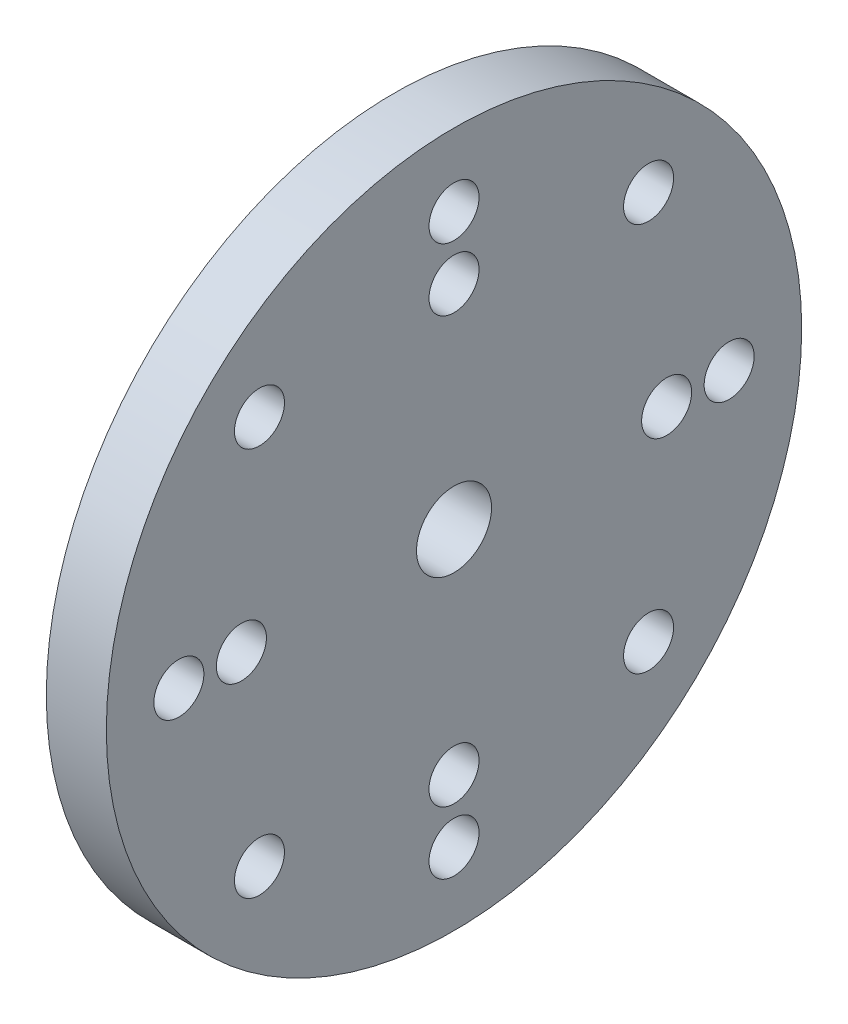
ISO-10303-21;
HEADER;
FILE_DESCRIPTION(('STEP AP214'),'2;1');
FILE_NAME('part.step','',(''),(''),'','','');
FILE_SCHEMA(('AUTOMOTIVE_DESIGN { 1 0 10303 214 1 1 1 1 }'));
ENDSEC;
DATA;
#1=APPLICATION_CONTEXT('core data for automotive mechanical design processes');
#2=APPLICATION_PROTOCOL_DEFINITION('international standard','automotive_design',2000,#1);
#3=PRODUCT_CONTEXT('',#1,'mechanical');
#4=PRODUCT('Part','Part','',(#3));
#5=PRODUCT_RELATED_PRODUCT_CATEGORY('part','',(#4));
#6=PRODUCT_DEFINITION_FORMATION('','',#4);
#7=PRODUCT_DEFINITION_CONTEXT('part definition',#1,'design');
#8=PRODUCT_DEFINITION('design','',#6,#7);
#9=PRODUCT_DEFINITION_SHAPE('','',#8);
#10=(LENGTH_UNIT() NAMED_UNIT(*) SI_UNIT(.MILLI.,.METRE.));
#11=(NAMED_UNIT(*) PLANE_ANGLE_UNIT() SI_UNIT($,.RADIAN.));
#12=(NAMED_UNIT(*) SI_UNIT($,.STERADIAN.) SOLID_ANGLE_UNIT());
#13=UNCERTAINTY_MEASURE_WITH_UNIT(LENGTH_MEASURE(1.E-05),#10,'distance_accuracy_value','');
#14=(GEOMETRIC_REPRESENTATION_CONTEXT(3) GLOBAL_UNCERTAINTY_ASSIGNED_CONTEXT((#13)) GLOBAL_UNIT_ASSIGNED_CONTEXT((#10,
#11,#12)) REPRESENTATION_CONTEXT('',''));
#15=CARTESIAN_POINT('',(0.,0.,0.));
#16=DIRECTION('',(0.,0.,1.));
#17=DIRECTION('',(1.,0.,0.));
#18=AXIS2_PLACEMENT_3D('',#15,#16,#17);
#19=CARTESIAN_POINT('',(0.,0.,0.));
#20=DIRECTION('',(1.,0.,0.));
#21=DIRECTION('',(0.,0.,-1.));
#22=AXIS2_PLACEMENT_3D('',#19,#20,#21);
#23=PLANE('',#22);
#24=CARTESIAN_POINT('',(0.,0.,0.));
#25=DIRECTION('',(1.,0.,0.));
#26=DIRECTION('',(0.,0.,-1.));
#27=AXIS2_PLACEMENT_3D('',#24,#25,#26);
#28=CIRCLE('',#27,1.5);
#29=CARTESIAN_POINT('',(0.,0.,-1.5));
#30=VERTEX_POINT('',#29);
#31=EDGE_CURVE('E123',#30,#30,#28,.T.);
#32=ORIENTED_EDGE('',*,*,#31,.T.);
#33=EDGE_LOOP('',(#32));
#34=FACE_BOUND('',#33,.T.);
#35=CARTESIAN_POINT('',(0.,0.,0.));
#36=DIRECTION('',(-1.,0.,0.));
#37=DIRECTION('',(0.,0.,1.));
#38=AXIS2_PLACEMENT_3D('',#35,#36,#37);
#39=CIRCLE('',#38,4.95);
#40=CARTESIAN_POINT('',(0.,0.,4.95));
#41=VERTEX_POINT('',#40);
#42=EDGE_CURVE('E10',#41,#41,#39,.T.);
#43=ORIENTED_EDGE('',*,*,#42,.T.);
#44=EDGE_LOOP('',(#43));
#45=FACE_BOUND('',#44,.T.);
#46=ADVANCED_FACE('F36',(#34,#45),#23,.F.);
#47=CARTESIAN_POINT('',(0.,0.,0.));
#48=DIRECTION('',(-1.,0.,0.));
#49=DIRECTION('',(0.,0.,1.));
#50=AXIS2_PLACEMENT_3D('',#47,#48,#49);
#51=CYLINDRICAL_SURFACE('',#50,4.95);
#52=ORIENTED_EDGE('',*,*,#42,.F.);
#53=EDGE_LOOP('',(#52));
#54=FACE_BOUND('',#53,.T.);
#55=CARTESIAN_POINT('',(2.,0.,0.));
#56=DIRECTION('',(-1.,0.,0.));
#57=DIRECTION('',(0.,0.,1.));
#58=AXIS2_PLACEMENT_3D('',#55,#56,#57);
#59=CIRCLE('',#58,4.95);
#60=CARTESIAN_POINT('',(2.,0.,4.95));
#61=VERTEX_POINT('',#60);
#62=EDGE_CURVE('E42',#61,#61,#59,.T.);
#63=ORIENTED_EDGE('',*,*,#62,.T.);
#64=EDGE_LOOP('',(#63));
#65=FACE_BOUND('',#64,.T.);
#66=ADVANCED_FACE('F176',(#54,#65),#51,.T.);
#67=CARTESIAN_POINT('',(2.,4.95,0.));
#68=DIRECTION('',(1.,0.,0.));
#69=DIRECTION('',(0.,0.,-1.));
#70=AXIS2_PLACEMENT_3D('',#67,#68,#69);
#71=PLANE('',#70);
#72=CARTESIAN_POINT('',(2.,0.,-8.5));
#73=DIRECTION('',(1.,0.,0.));
#74=DIRECTION('',(0.,0.,-1.));
#75=AXIS2_PLACEMENT_3D('',#72,#73,#74);
#76=CIRCLE('',#75,1.);
#77=CARTESIAN_POINT('',(2.,0.,-9.5));
#78=VERTEX_POINT('',#77);
#79=EDGE_CURVE('E107',#78,#78,#76,.T.);
#80=ORIENTED_EDGE('',*,*,#79,.T.);
#81=EDGE_LOOP('',(#80));
#82=FACE_BOUND('',#81,.T.);
#83=CARTESIAN_POINT('',(2.,-8.5,0.));
#84=DIRECTION('',(1.,0.,0.));
#85=DIRECTION('',(0.,0.,-1.));
#86=AXIS2_PLACEMENT_3D('',#83,#84,#85);
#87=CIRCLE('',#86,1.);
#88=CARTESIAN_POINT('',(2.,-8.5,-1.));
#89=VERTEX_POINT('',#88);
#90=EDGE_CURVE('E112',#89,#89,#87,.T.);
#91=ORIENTED_EDGE('',*,*,#90,.T.);
#92=EDGE_LOOP('',(#91));
#93=FACE_BOUND('',#92,.T.);
#94=CARTESIAN_POINT('',(2.,0.,8.5));
#95=DIRECTION('',(1.,0.,0.));
#96=DIRECTION('',(0.,0.,-1.));
#97=AXIS2_PLACEMENT_3D('',#94,#95,#96);
#98=CIRCLE('',#97,1.);
#99=CARTESIAN_POINT('',(2.,0.,7.5));
#100=VERTEX_POINT('',#99);
#101=EDGE_CURVE('E115',#100,#100,#98,.T.);
#102=ORIENTED_EDGE('',*,*,#101,.T.);
#103=EDGE_LOOP('',(#102));
#104=FACE_BOUND('',#103,.T.);
#105=CARTESIAN_POINT('',(2.,0.,-11.));
#106=DIRECTION('',(1.,0.,0.));
#107=DIRECTION('',(0.,0.,-1.));
#108=AXIS2_PLACEMENT_3D('',#105,#106,#107);
#109=CIRCLE('',#108,1.);
#110=CARTESIAN_POINT('',(2.,0.,-12.));
#111=VERTEX_POINT('',#110);
#112=EDGE_CURVE('E67',#111,#111,#109,.T.);
#113=ORIENTED_EDGE('',*,*,#112,.T.);
#114=EDGE_LOOP('',(#113));
#115=FACE_BOUND('',#114,.T.);
#116=CARTESIAN_POINT('',(2.,-7.77817459305206,-7.77817459305198));
#117=DIRECTION('',(1.,0.,0.));
#118=DIRECTION('',(0.,0.,-1.));
#119=AXIS2_PLACEMENT_3D('',#116,#117,#118);
#120=CIRCLE('',#119,1.);
#121=CARTESIAN_POINT('',(2.,-7.77817459305206,-8.77817459305198));
#122=VERTEX_POINT('',#121);
#123=EDGE_CURVE('E70',#122,#122,#120,.T.);
#124=ORIENTED_EDGE('',*,*,#123,.T.);
#125=EDGE_LOOP('',(#124));
#126=FACE_BOUND('',#125,.T.);
#127=CARTESIAN_POINT('',(2.,-11.,0.));
#128=DIRECTION('',(1.,0.,0.));
#129=DIRECTION('',(0.,0.,-1.));
#130=AXIS2_PLACEMENT_3D('',#127,#128,#129);
#131=CIRCLE('',#130,1.);
#132=CARTESIAN_POINT('',(2.,-11.,-1.));
#133=VERTEX_POINT('',#132);
#134=EDGE_CURVE('E73',#133,#133,#131,.T.);
#135=ORIENTED_EDGE('',*,*,#134,.T.);
#136=EDGE_LOOP('',(#135));
#137=FACE_BOUND('',#136,.T.);
#138=CARTESIAN_POINT('',(2.,-7.77817459305195,7.77817459305209));
#139=DIRECTION('',(1.,0.,0.));
#140=DIRECTION('',(0.,0.,-1.));
#141=AXIS2_PLACEMENT_3D('',#138,#139,#140);
#142=CIRCLE('',#141,1.);
#143=CARTESIAN_POINT('',(2.,-7.77817459305195,6.77817459305209));
#144=VERTEX_POINT('',#143);
#145=EDGE_CURVE('E76',#144,#144,#142,.T.);
#146=ORIENTED_EDGE('',*,*,#145,.T.);
#147=EDGE_LOOP('',(#146));
#148=FACE_BOUND('',#147,.T.);
#149=CARTESIAN_POINT('',(2.,1.15218884181823E-13,11.));
#150=DIRECTION('',(1.,0.,0.));
#151=DIRECTION('',(0.,0.,-1.));
#152=AXIS2_PLACEMENT_3D('',#149,#150,#151);
#153=CIRCLE('',#152,1.);
#154=CARTESIAN_POINT('',(2.,1.15218884181823E-13,10.));
#155=VERTEX_POINT('',#154);
#156=EDGE_CURVE('E79',#155,#155,#153,.T.);
#157=ORIENTED_EDGE('',*,*,#156,.T.);
#158=EDGE_LOOP('',(#157));
#159=FACE_BOUND('',#158,.T.);
#160=CARTESIAN_POINT('',(2.,7.77817459305212,7.77817459305193));
#161=DIRECTION('',(1.,0.,0.));
#162=DIRECTION('',(0.,0.,-1.));
#163=AXIS2_PLACEMENT_3D('',#160,#161,#162);
#164=CIRCLE('',#163,1.);
#165=CARTESIAN_POINT('',(2.,7.77817459305212,6.77817459305193));
#166=VERTEX_POINT('',#165);
#167=EDGE_CURVE('E82',#166,#166,#164,.T.);
#168=ORIENTED_EDGE('',*,*,#167,.T.);
#169=EDGE_LOOP('',(#168));
#170=FACE_BOUND('',#169,.T.);
#171=CARTESIAN_POINT('',(2.,7.77817459305201,-7.77817459305204));
#172=DIRECTION('',(1.,0.,0.));
#173=DIRECTION('',(0.,0.,-1.));
#174=AXIS2_PLACEMENT_3D('',#171,#172,#173);
#175=CIRCLE('',#174,1.);
#176=CARTESIAN_POINT('',(2.,7.77817459305201,-8.77817459305204));
#177=VERTEX_POINT('',#176);
#178=EDGE_CURVE('E85',#177,#177,#175,.T.);
#179=ORIENTED_EDGE('',*,*,#178,.T.);
#180=EDGE_LOOP('',(#179));
#181=FACE_BOUND('',#180,.T.);
#182=CARTESIAN_POINT('',(2.,8.5,0.));
#183=DIRECTION('',(1.,0.,0.));
#184=DIRECTION('',(0.,0.,-1.));
#185=AXIS2_PLACEMENT_3D('',#182,#183,#184);
#186=CIRCLE('',#185,1.);
#187=CARTESIAN_POINT('',(2.,8.5,-1.));
#188=VERTEX_POINT('',#187);
#189=EDGE_CURVE('E61',#188,#188,#186,.T.);
#190=ORIENTED_EDGE('',*,*,#189,.T.);
#191=EDGE_LOOP('',(#190));
#192=FACE_BOUND('',#191,.T.);
#193=CARTESIAN_POINT('',(2.,11.,0.));
#194=DIRECTION('',(1.,0.,0.));
#195=DIRECTION('',(0.,0.,-1.));
#196=AXIS2_PLACEMENT_3D('',#193,#194,#195);
#197=CIRCLE('',#196,1.);
#198=CARTESIAN_POINT('',(2.,11.,-1.));
#199=VERTEX_POINT('',#198);
#200=EDGE_CURVE('E55',#199,#199,#197,.T.);
#201=ORIENTED_EDGE('',*,*,#200,.T.);
#202=EDGE_LOOP('',(#201));
#203=FACE_BOUND('',#202,.T.);
#204=ORIENTED_EDGE('',*,*,#62,.F.);
#205=EDGE_LOOP('',(#204));
#206=FACE_BOUND('',#205,.T.);
#207=CARTESIAN_POINT('',(2.,0.,0.));
#208=DIRECTION('',(-1.,0.,0.));
#209=DIRECTION('',(0.,0.,1.));
#210=AXIS2_PLACEMENT_3D('',#207,#208,#209);
#211=CIRCLE('',#210,13.9);
#212=CARTESIAN_POINT('',(2.,0.,13.9));
#213=VERTEX_POINT('',#212);
#214=EDGE_CURVE('E46',#213,#213,#211,.T.);
#215=ORIENTED_EDGE('',*,*,#214,.T.);
#216=EDGE_LOOP('',(#215));
#217=FACE_BOUND('',#216,.T.);
#218=ADVANCED_FACE('F170',(#82,#93,#104,#115,#126,#137,#148,#159,#170,#181,#192,#203,#206,#217),
#71,.F.);
#219=CARTESIAN_POINT('',(0.,0.,0.));
#220=DIRECTION('',(-1.,0.,0.));
#221=DIRECTION('',(0.,0.,1.));
#222=AXIS2_PLACEMENT_3D('',#219,#220,#221);
#223=CYLINDRICAL_SURFACE('',#222,13.9);
#224=ORIENTED_EDGE('',*,*,#214,.F.);
#225=EDGE_LOOP('',(#224));
#226=FACE_BOUND('',#225,.T.);
#227=CARTESIAN_POINT('',(4.4,0.,0.));
#228=DIRECTION('',(-1.,0.,0.));
#229=DIRECTION('',(0.,0.,1.));
#230=AXIS2_PLACEMENT_3D('',#227,#228,#229);
#231=CIRCLE('',#230,13.9);
#232=CARTESIAN_POINT('',(4.4,0.,13.9));
#233=VERTEX_POINT('',#232);
#234=EDGE_CURVE('E50',#233,#233,#231,.T.);
#235=ORIENTED_EDGE('',*,*,#234,.T.);
#236=EDGE_LOOP('',(#235));
#237=FACE_BOUND('',#236,.T.);
#238=ADVANCED_FACE('F141',(#226,#237),#223,.T.);
#239=CARTESIAN_POINT('',(4.4,13.9,0.));
#240=DIRECTION('',(-1.,0.,0.));
#241=DIRECTION('',(0.,0.,1.));
#242=AXIS2_PLACEMENT_3D('',#239,#240,#241);
#243=PLANE('',#242);
#244=CARTESIAN_POINT('',(4.4,0.,0.));
#245=DIRECTION('',(1.,0.,0.));
#246=DIRECTION('',(0.,0.,-1.));
#247=AXIS2_PLACEMENT_3D('',#244,#245,#246);
#248=CIRCLE('',#247,1.5);
#249=CARTESIAN_POINT('',(4.4,0.,-1.5));
#250=VERTEX_POINT('',#249);
#251=EDGE_CURVE('E130',#250,#250,#248,.T.);
#252=ORIENTED_EDGE('',*,*,#251,.F.);
#253=EDGE_LOOP('',(#252));
#254=FACE_BOUND('',#253,.T.);
#255=CARTESIAN_POINT('',(4.4,0.,-8.5));
#256=DIRECTION('',(1.,0.,0.));
#257=DIRECTION('',(0.,-1.,0.));
#258=AXIS2_PLACEMENT_3D('',#255,#256,#257);
#259=CIRCLE('',#258,1.);
#260=CARTESIAN_POINT('',(4.4,-1.00000000000003,-8.5));
#261=VERTEX_POINT('',#260);
#262=EDGE_CURVE('E118',#261,#261,#259,.T.);
#263=ORIENTED_EDGE('',*,*,#262,.F.);
#264=EDGE_LOOP('',(#263));
#265=FACE_BOUND('',#264,.T.);
#266=CARTESIAN_POINT('',(4.4,-8.5,0.));
#267=DIRECTION('',(1.,0.,0.));
#268=DIRECTION('',(0.,0.,1.));
#269=AXIS2_PLACEMENT_3D('',#266,#267,#268);
#270=CIRCLE('',#269,1.);
#271=CARTESIAN_POINT('',(4.4,-8.5,1.));
#272=VERTEX_POINT('',#271);
#273=EDGE_CURVE('E122',#272,#272,#270,.T.);
#274=ORIENTED_EDGE('',*,*,#273,.F.);
#275=EDGE_LOOP('',(#274));
#276=FACE_BOUND('',#275,.T.);
#277=CARTESIAN_POINT('',(4.4,0.,8.5));
#278=DIRECTION('',(1.,0.,0.));
#279=DIRECTION('',(0.,1.,0.));
#280=AXIS2_PLACEMENT_3D('',#277,#278,#279);
#281=CIRCLE('',#280,1.);
#282=CARTESIAN_POINT('',(4.4,1.00000000000009,8.49999999999999));
#283=VERTEX_POINT('',#282);
#284=EDGE_CURVE('E119',#283,#283,#281,.T.);
#285=ORIENTED_EDGE('',*,*,#284,.F.);
#286=EDGE_LOOP('',(#285));
#287=FACE_BOUND('',#286,.T.);
#288=CARTESIAN_POINT('',(4.4,0.,-11.));
#289=DIRECTION('',(1.,0.,0.));
#290=DIRECTION('',(0.,-1.,0.));
#291=AXIS2_PLACEMENT_3D('',#288,#289,#290);
#292=CIRCLE('',#291,1.);
#293=CARTESIAN_POINT('',(4.4,-1.00000000000004,-11.));
#294=VERTEX_POINT('',#293);
#295=EDGE_CURVE('E91',#294,#294,#292,.T.);
#296=ORIENTED_EDGE('',*,*,#295,.F.);
#297=EDGE_LOOP('',(#296));
#298=FACE_BOUND('',#297,.T.);
#299=CARTESIAN_POINT('',(4.4,-7.77817459305206,-7.77817459305198));
#300=DIRECTION('',(1.,0.,0.));
#301=DIRECTION('',(0.,-0.707106781186544,0.707106781186551));
#302=AXIS2_PLACEMENT_3D('',#299,#300,#301);
#303=CIRCLE('',#302,1.);
#304=CARTESIAN_POINT('',(4.4,-8.48528137423861,-7.07106781186543));
#305=VERTEX_POINT('',#304);
#306=EDGE_CURVE('E99',#305,#305,#303,.T.);
#307=ORIENTED_EDGE('',*,*,#306,.F.);
#308=EDGE_LOOP('',(#307));
#309=FACE_BOUND('',#308,.T.);
#310=CARTESIAN_POINT('',(4.4,-11.,0.));
#311=DIRECTION('',(1.,0.,0.));
#312=DIRECTION('',(0.,0.,1.));
#313=AXIS2_PLACEMENT_3D('',#310,#311,#312);
#314=CIRCLE('',#313,1.);
#315=CARTESIAN_POINT('',(4.4,-11.,1.));
#316=VERTEX_POINT('',#315);
#317=EDGE_CURVE('E95',#316,#316,#314,.T.);
#318=ORIENTED_EDGE('',*,*,#317,.F.);
#319=EDGE_LOOP('',(#318));
#320=FACE_BOUND('',#319,.T.);
#321=CARTESIAN_POINT('',(4.4,-7.77817459305195,7.77817459305209));
#322=DIRECTION('',(1.,0.,0.));
#323=DIRECTION('',(0.,0.707106781186554,0.707106781186541));
#324=AXIS2_PLACEMENT_3D('',#321,#322,#323);
#325=CIRCLE('',#324,1.);
#326=CARTESIAN_POINT('',(4.4,-7.0710678118654,8.48528137423863));
#327=VERTEX_POINT('',#326);
#328=EDGE_CURVE('E92',#327,#327,#325,.T.);
#329=ORIENTED_EDGE('',*,*,#328,.F.);
#330=EDGE_LOOP('',(#329));
#331=FACE_BOUND('',#330,.T.);
#332=CARTESIAN_POINT('',(4.4,1.15218884181823E-13,11.));
#333=DIRECTION('',(1.,0.,0.));
#334=DIRECTION('',(0.,1.,0.));
#335=AXIS2_PLACEMENT_3D('',#332,#333,#334);
#336=CIRCLE('',#335,1.);
#337=CARTESIAN_POINT('',(4.4,1.00000000000012,11.));
#338=VERTEX_POINT('',#337);
#339=EDGE_CURVE('E96',#338,#338,#336,.T.);
#340=ORIENTED_EDGE('',*,*,#339,.F.);
#341=EDGE_LOOP('',(#340));
#342=FACE_BOUND('',#341,.T.);
#343=CARTESIAN_POINT('',(4.4,7.77817459305212,7.77817459305193));
#344=DIRECTION('',(1.,0.,0.));
#345=DIRECTION('',(0.,0.707106781186539,-0.707106781186556));
#346=AXIS2_PLACEMENT_3D('',#343,#344,#345);
#347=CIRCLE('',#346,1.);
#348=CARTESIAN_POINT('',(4.4,8.48528137423866,7.07106781186537));
#349=VERTEX_POINT('',#348);
#350=EDGE_CURVE('E104',#349,#349,#347,.T.);
#351=ORIENTED_EDGE('',*,*,#350,.F.);
#352=EDGE_LOOP('',(#351));
#353=FACE_BOUND('',#352,.T.);
#354=CARTESIAN_POINT('',(4.4,7.77817459305201,-7.77817459305204));
#355=DIRECTION('',(1.,0.,0.));
#356=DIRECTION('',(0.,-0.707106781186549,-0.707106781186546));
#357=AXIS2_PLACEMENT_3D('',#354,#355,#356);
#358=CIRCLE('',#357,1.);
#359=CARTESIAN_POINT('',(4.4,7.07106781186546,-8.48528137423858));
#360=VERTEX_POINT('',#359);
#361=EDGE_CURVE('E88',#360,#360,#358,.T.);
#362=ORIENTED_EDGE('',*,*,#361,.F.);
#363=EDGE_LOOP('',(#362));
#364=FACE_BOUND('',#363,.T.);
#365=CARTESIAN_POINT('',(4.4,8.5,0.));
#366=DIRECTION('',(1.,0.,0.));
#367=DIRECTION('',(0.,0.,-1.));
#368=AXIS2_PLACEMENT_3D('',#365,#366,#367);
#369=CIRCLE('',#368,1.);
#370=CARTESIAN_POINT('',(4.4,8.5,-1.));
#371=VERTEX_POINT('',#370);
#372=EDGE_CURVE('E64',#371,#371,#369,.T.);
#373=ORIENTED_EDGE('',*,*,#372,.F.);
#374=EDGE_LOOP('',(#373));
#375=FACE_BOUND('',#374,.T.);
#376=CARTESIAN_POINT('',(4.4,11.,0.));
#377=DIRECTION('',(1.,0.,0.));
#378=DIRECTION('',(0.,0.,-1.));
#379=AXIS2_PLACEMENT_3D('',#376,#377,#378);
#380=CIRCLE('',#379,1.);
#381=CARTESIAN_POINT('',(4.4,11.,-1.));
#382=VERTEX_POINT('',#381);
#383=EDGE_CURVE('E58',#382,#382,#380,.T.);
#384=ORIENTED_EDGE('',*,*,#383,.F.);
#385=EDGE_LOOP('',(#384));
#386=FACE_BOUND('',#385,.T.);
#387=ORIENTED_EDGE('',*,*,#234,.F.);
#388=EDGE_LOOP('',(#387));
#389=FACE_BOUND('',#388,.T.);
#390=ADVANCED_FACE('F137',(#254,#265,#276,#287,#298,#309,#320,#331,#342,#353,#364,#375,#386,
#389),#243,.F.);
#391=CARTESIAN_POINT('',(-5.6,11.,0.));
#392=DIRECTION('',(1.,0.,0.));
#393=DIRECTION('',(0.,0.,-1.));
#394=AXIS2_PLACEMENT_3D('',#391,#392,#393);
#395=CYLINDRICAL_SURFACE('',#394,1.);
#396=ORIENTED_EDGE('',*,*,#383,.T.);
#397=EDGE_LOOP('',(#396));
#398=FACE_BOUND('',#397,.T.);
#399=ORIENTED_EDGE('',*,*,#200,.F.);
#400=EDGE_LOOP('',(#399));
#401=FACE_BOUND('',#400,.T.);
#402=ADVANCED_FACE('F140',(#398,#401),#395,.F.);
#403=CARTESIAN_POINT('',(-5.6,8.5,0.));
#404=DIRECTION('',(1.,0.,0.));
#405=DIRECTION('',(0.,0.,-1.));
#406=AXIS2_PLACEMENT_3D('',#403,#404,#405);
#407=CYLINDRICAL_SURFACE('',#406,1.);
#408=ORIENTED_EDGE('',*,*,#372,.T.);
#409=EDGE_LOOP('',(#408));
#410=FACE_BOUND('',#409,.T.);
#411=ORIENTED_EDGE('',*,*,#189,.F.);
#412=EDGE_LOOP('',(#411));
#413=FACE_BOUND('',#412,.T.);
#414=ADVANCED_FACE('F231',(#410,#413),#407,.F.);
#415=CARTESIAN_POINT('',(-5.6,7.77817459305201,-7.77817459305204));
#416=DIRECTION('',(1.,0.,0.));
#417=DIRECTION('',(0.,0.,-1.));
#418=AXIS2_PLACEMENT_3D('',#415,#416,#417);
#419=CYLINDRICAL_SURFACE('',#418,1.);
#420=ORIENTED_EDGE('',*,*,#361,.T.);
#421=EDGE_LOOP('',(#420));
#422=FACE_BOUND('',#421,.T.);
#423=ORIENTED_EDGE('',*,*,#178,.F.);
#424=EDGE_LOOP('',(#423));
#425=FACE_BOUND('',#424,.T.);
#426=ADVANCED_FACE('F213',(#422,#425),#419,.F.);
#427=CARTESIAN_POINT('',(-5.6,7.77817459305212,7.77817459305193));
#428=DIRECTION('',(1.,0.,0.));
#429=DIRECTION('',(0.,0.,-1.));
#430=AXIS2_PLACEMENT_3D('',#427,#428,#429);
#431=CYLINDRICAL_SURFACE('',#430,1.);
#432=ORIENTED_EDGE('',*,*,#350,.T.);
#433=EDGE_LOOP('',(#432));
#434=FACE_BOUND('',#433,.T.);
#435=ORIENTED_EDGE('',*,*,#167,.F.);
#436=EDGE_LOOP('',(#435));
#437=FACE_BOUND('',#436,.T.);
#438=ADVANCED_FACE('F209',(#434,#437),#431,.F.);
#439=CARTESIAN_POINT('',(-5.6,1.15218884181823E-13,11.));
#440=DIRECTION('',(1.,0.,0.));
#441=DIRECTION('',(0.,0.,-1.));
#442=AXIS2_PLACEMENT_3D('',#439,#440,#441);
#443=CYLINDRICAL_SURFACE('',#442,1.);
#444=ORIENTED_EDGE('',*,*,#339,.T.);
#445=EDGE_LOOP('',(#444));
#446=FACE_BOUND('',#445,.T.);
#447=ORIENTED_EDGE('',*,*,#156,.F.);
#448=EDGE_LOOP('',(#447));
#449=FACE_BOUND('',#448,.T.);
#450=ADVANCED_FACE('F205',(#446,#449),#443,.F.);
#451=CARTESIAN_POINT('',(-5.6,-7.77817459305195,7.77817459305209));
#452=DIRECTION('',(1.,0.,0.));
#453=DIRECTION('',(0.,0.,-1.));
#454=AXIS2_PLACEMENT_3D('',#451,#452,#453);
#455=CYLINDRICAL_SURFACE('',#454,1.);
#456=ORIENTED_EDGE('',*,*,#328,.T.);
#457=EDGE_LOOP('',(#456));
#458=FACE_BOUND('',#457,.T.);
#459=ORIENTED_EDGE('',*,*,#145,.F.);
#460=EDGE_LOOP('',(#459));
#461=FACE_BOUND('',#460,.T.);
#462=ADVANCED_FACE('F208',(#458,#461),#455,.F.);
#463=CARTESIAN_POINT('',(-5.6,-11.,0.));
#464=DIRECTION('',(1.,0.,0.));
#465=DIRECTION('',(0.,0.,-1.));
#466=AXIS2_PLACEMENT_3D('',#463,#464,#465);
#467=CYLINDRICAL_SURFACE('',#466,1.);
#468=ORIENTED_EDGE('',*,*,#317,.T.);
#469=EDGE_LOOP('',(#468));
#470=FACE_BOUND('',#469,.T.);
#471=ORIENTED_EDGE('',*,*,#134,.F.);
#472=EDGE_LOOP('',(#471));
#473=FACE_BOUND('',#472,.T.);
#474=ADVANCED_FACE('F221',(#470,#473),#467,.F.);
#475=CARTESIAN_POINT('',(-5.6,-7.77817459305206,-7.77817459305198));
#476=DIRECTION('',(1.,0.,0.));
#477=DIRECTION('',(0.,0.,-1.));
#478=AXIS2_PLACEMENT_3D('',#475,#476,#477);
#479=CYLINDRICAL_SURFACE('',#478,1.);
#480=ORIENTED_EDGE('',*,*,#306,.T.);
#481=EDGE_LOOP('',(#480));
#482=FACE_BOUND('',#481,.T.);
#483=ORIENTED_EDGE('',*,*,#123,.F.);
#484=EDGE_LOOP('',(#483));
#485=FACE_BOUND('',#484,.T.);
#486=ADVANCED_FACE('F217',(#482,#485),#479,.F.);
#487=CARTESIAN_POINT('',(-5.6,0.,-11.));
#488=DIRECTION('',(1.,0.,0.));
#489=DIRECTION('',(0.,0.,-1.));
#490=AXIS2_PLACEMENT_3D('',#487,#488,#489);
#491=CYLINDRICAL_SURFACE('',#490,1.);
#492=ORIENTED_EDGE('',*,*,#295,.T.);
#493=EDGE_LOOP('',(#492));
#494=FACE_BOUND('',#493,.T.);
#495=ORIENTED_EDGE('',*,*,#112,.F.);
#496=EDGE_LOOP('',(#495));
#497=FACE_BOUND('',#496,.T.);
#498=ADVANCED_FACE('F203',(#494,#497),#491,.F.);
#499=CARTESIAN_POINT('',(-5.6,0.,8.5));
#500=DIRECTION('',(1.,0.,0.));
#501=DIRECTION('',(0.,0.,-1.));
#502=AXIS2_PLACEMENT_3D('',#499,#500,#501);
#503=CYLINDRICAL_SURFACE('',#502,1.);
#504=ORIENTED_EDGE('',*,*,#284,.T.);
#505=EDGE_LOOP('',(#504));
#506=FACE_BOUND('',#505,.T.);
#507=ORIENTED_EDGE('',*,*,#101,.F.);
#508=EDGE_LOOP('',(#507));
#509=FACE_BOUND('',#508,.T.);
#510=ADVANCED_FACE('F199',(#506,#509),#503,.F.);
#511=CARTESIAN_POINT('',(-5.6,-8.5,0.));
#512=DIRECTION('',(1.,0.,0.));
#513=DIRECTION('',(0.,0.,-1.));
#514=AXIS2_PLACEMENT_3D('',#511,#512,#513);
#515=CYLINDRICAL_SURFACE('',#514,1.);
#516=ORIENTED_EDGE('',*,*,#273,.T.);
#517=EDGE_LOOP('',(#516));
#518=FACE_BOUND('',#517,.T.);
#519=ORIENTED_EDGE('',*,*,#90,.F.);
#520=EDGE_LOOP('',(#519));
#521=FACE_BOUND('',#520,.T.);
#522=ADVANCED_FACE('F193',(#518,#521),#515,.F.);
#523=CARTESIAN_POINT('',(-5.6,0.,-8.5));
#524=DIRECTION('',(1.,0.,0.));
#525=DIRECTION('',(0.,0.,-1.));
#526=AXIS2_PLACEMENT_3D('',#523,#524,#525);
#527=CYLINDRICAL_SURFACE('',#526,1.);
#528=ORIENTED_EDGE('',*,*,#262,.T.);
#529=EDGE_LOOP('',(#528));
#530=FACE_BOUND('',#529,.T.);
#531=ORIENTED_EDGE('',*,*,#79,.F.);
#532=EDGE_LOOP('',(#531));
#533=FACE_BOUND('',#532,.T.);
#534=ADVANCED_FACE('F188',(#530,#533),#527,.F.);
#535=CARTESIAN_POINT('',(-5.6,0.,0.));
#536=DIRECTION('',(1.,0.,0.));
#537=DIRECTION('',(0.,0.,-1.));
#538=AXIS2_PLACEMENT_3D('',#535,#536,#537);
#539=CYLINDRICAL_SURFACE('',#538,1.5);
#540=ORIENTED_EDGE('',*,*,#251,.T.);
#541=EDGE_LOOP('',(#540));
#542=FACE_BOUND('',#541,.T.);
#543=ORIENTED_EDGE('',*,*,#31,.F.);
#544=EDGE_LOOP('',(#543));
#545=FACE_BOUND('',#544,.T.);
#546=ADVANCED_FACE('F134',(#542,#545),#539,.F.);
#547=CLOSED_SHELL('',(#46,#66,#218,#238,#390,#402,#414,#426,#438,#450,#462,#474,#486,#498,#510,
#522,#534,#546));
#548=MANIFOLD_SOLID_BREP('B2',#547);
#549=ADVANCED_BREP_SHAPE_REPRESENTATION('',(#18,#548),#14);
#550=SHAPE_DEFINITION_REPRESENTATION(#9,#549);
ENDSEC;
END-ISO-10303-21;
